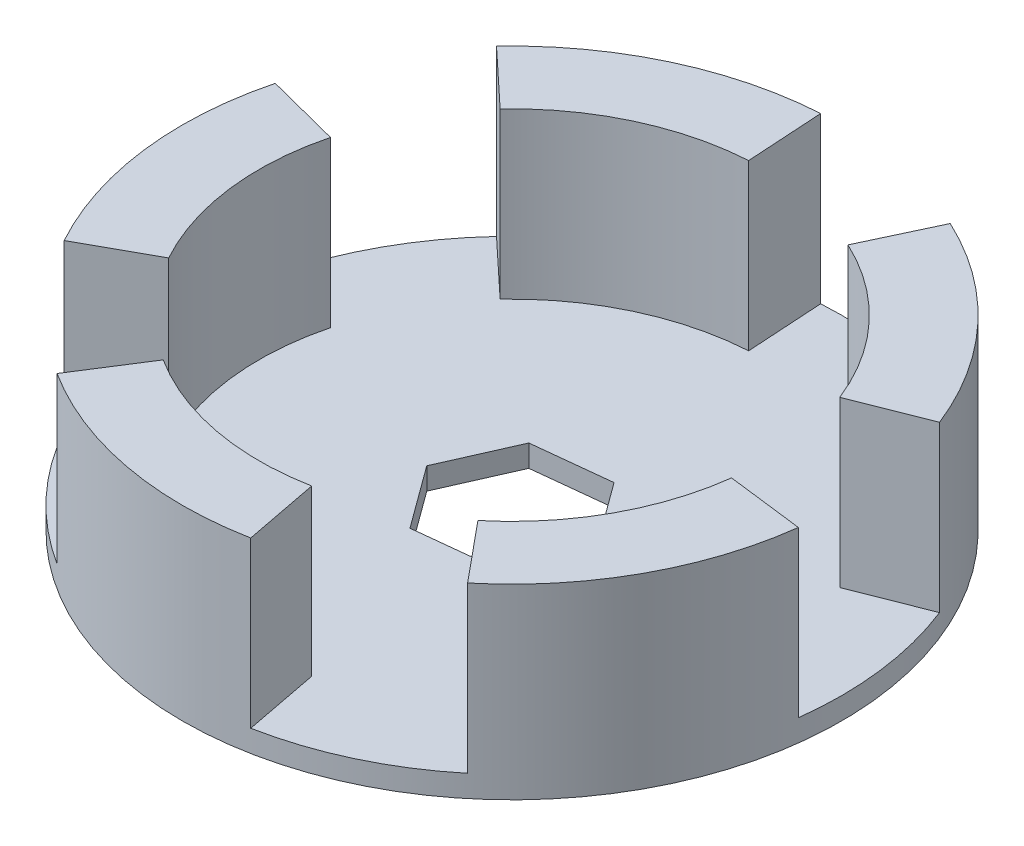
ISO-10303-21;
HEADER;
FILE_DESCRIPTION(('STEP AP214'),'2;1');
FILE_NAME('part.step','',(''),(''),'','','');
FILE_SCHEMA(('AUTOMOTIVE_DESIGN { 1 0 10303 214 1 1 1 1 }'));
ENDSEC;
DATA;
#1=APPLICATION_CONTEXT('core data for automotive mechanical design processes');
#2=APPLICATION_PROTOCOL_DEFINITION('international standard','automotive_design',2000,#1);
#3=PRODUCT_CONTEXT('',#1,'mechanical');
#4=PRODUCT('Part','Part','',(#3));
#5=PRODUCT_RELATED_PRODUCT_CATEGORY('part','',(#4));
#6=PRODUCT_DEFINITION_FORMATION('','',#4);
#7=PRODUCT_DEFINITION_CONTEXT('part definition',#1,'design');
#8=PRODUCT_DEFINITION('design','',#6,#7);
#9=PRODUCT_DEFINITION_SHAPE('','',#8);
#10=(LENGTH_UNIT() NAMED_UNIT(*) SI_UNIT(.MILLI.,.METRE.));
#11=(NAMED_UNIT(*) PLANE_ANGLE_UNIT() SI_UNIT($,.RADIAN.));
#12=(NAMED_UNIT(*) SI_UNIT($,.STERADIAN.) SOLID_ANGLE_UNIT());
#13=UNCERTAINTY_MEASURE_WITH_UNIT(LENGTH_MEASURE(1.E-05),#10,'distance_accuracy_value','');
#14=(GEOMETRIC_REPRESENTATION_CONTEXT(3) GLOBAL_UNCERTAINTY_ASSIGNED_CONTEXT((#13)) GLOBAL_UNIT_ASSIGNED_CONTEXT((#10,
#11,#12)) REPRESENTATION_CONTEXT('',''));
#15=CARTESIAN_POINT('',(0.,0.,0.));
#16=DIRECTION('',(0.,0.,1.));
#17=DIRECTION('',(1.,0.,0.));
#18=AXIS2_PLACEMENT_3D('',#15,#16,#17);
#19=CARTESIAN_POINT('',(0.,2.,0.));
#20=DIRECTION('',(0.,1.,0.));
#21=DIRECTION('',(0.,0.,1.));
#22=AXIS2_PLACEMENT_3D('',#19,#20,#21);
#23=PLANE('',#22);
#24=DIRECTION('',(-0.590285720446563,0.,-0.807194380701998));
#25=VECTOR('',#24,1.);
#26=CARTESIAN_POINT('',(4.92388572228219,2.,-3.60074289472403));
#27=LINE('',#26,#25);
#28=CARTESIAN_POINT('',(7.00277560183374,2.,-0.757936147505458));
#29=VERTEX_POINT('',#28);
#30=CARTESIAN_POINT('',(2.84499584273063,2.,-6.44354964194261));
#31=VERTEX_POINT('',#30);
#32=EDGE_CURVE('E257',#29,#31,#27,.T.);
#33=ORIENTED_EDGE('',*,*,#32,.F.);
#34=DIRECTION('',(0.403907979256696,0.,-0.914799619748922));
#35=VECTOR('',#34,1.);
#36=CARTESIAN_POINT('',(5.58027768046842,2.,2.46383867346585));
#37=LINE('',#36,#35);
#38=CARTESIAN_POINT('',(4.15777975910311,2.,5.68561349443715));
#39=VERTEX_POINT('',#38);
#40=EDGE_CURVE('E242',#39,#29,#37,.T.);
#41=ORIENTED_EDGE('',*,*,#40,.F.);
#42=DIRECTION('',(0.994193699703259,0.,-0.107605239046924));
#43=VECTOR('',#42,1.);
#44=CARTESIAN_POINT('',(0.656391958186239,2.,6.06458156818988));
#45=LINE('',#44,#43);
#46=CARTESIAN_POINT('',(-2.84499584273063,2.,6.44354964194261));
#47=VERTEX_POINT('',#46);
#48=EDGE_CURVE('E215',#47,#39,#45,.T.);
#49=ORIENTED_EDGE('',*,*,#48,.F.);
#50=DIRECTION('',(0.590285720446563,0.,0.807194380701998));
#51=VECTOR('',#50,1.);
#52=CARTESIAN_POINT('',(-4.92388572228219,2.,3.60074289472403));
#53=LINE('',#52,#51);
#54=CARTESIAN_POINT('',(-7.00277560183374,2.,0.75793614750546));
#55=VERTEX_POINT('',#54);
#56=EDGE_CURVE('E251',#55,#47,#53,.T.);
#57=ORIENTED_EDGE('',*,*,#56,.F.);
#58=DIRECTION('',(-0.403907979256696,0.,0.914799619748922));
#59=VECTOR('',#58,1.);
#60=CARTESIAN_POINT('',(-5.58027768046843,2.,-2.46383867346585));
#61=LINE('',#60,#59);
#62=CARTESIAN_POINT('',(-4.15777975910311,2.,-5.68561349443715));
#63=VERTEX_POINT('',#62);
#64=EDGE_CURVE('E253',#63,#55,#61,.T.);
#65=ORIENTED_EDGE('',*,*,#64,.F.);
#66=DIRECTION('',(-0.994193699703259,0.,0.107605239046924));
#67=VECTOR('',#66,1.);
#68=CARTESIAN_POINT('',(-0.656391958186239,2.,-6.06458156818988));
#69=LINE('',#68,#67);
#70=EDGE_CURVE('E255',#31,#63,#69,.T.);
#71=ORIENTED_EDGE('',*,*,#70,.F.);
#72=EDGE_LOOP('',(#33,#41,#49,#57,#65,#71));
#73=FACE_BOUND('',#72,.T.);
#74=CARTESIAN_POINT('',(0.,2.,0.));
#75=DIRECTION('',(0.,1.,0.));
#76=DIRECTION('',(0.,0.,1.));
#77=AXIS2_PLACEMENT_3D('',#74,#75,#76);
#78=CIRCLE('',#77,30.);
#79=CARTESIAN_POINT('',(-21.9070270257039,2.,-20.4959061008553));
#80=VERTEX_POINT('',#79);
#81=CARTESIAN_POINT('',(-29.0481518665361,2.,-7.4969909389473));
#82=VERTEX_POINT('',#81);
#83=EDGE_CURVE('E11',#80,#82,#78,.T.);
#84=ORIENTED_EDGE('',*,*,#83,.T.);
#85=DIRECTION('',(-0.968271728884535,0.,-0.249899697964911));
#86=VECTOR('',#85,1.);
#87=CARTESIAN_POINT('',(-22.2702497643443,2.,-5.74769305319293));
#88=LINE('',#87,#86);
#89=CARTESIAN_POINT('',(-22.2702497643443,2.,-5.74769305319293));
#90=VERTEX_POINT('',#89);
#91=EDGE_CURVE('E273',#90,#82,#88,.T.);
#92=ORIENTED_EDGE('',*,*,#91,.F.);
#93=CARTESIAN_POINT('',(0.,2.,0.));
#94=DIRECTION('',(0.,-1.,0.));
#95=DIRECTION('',(0.,0.,-1.));
#96=AXIS2_PLACEMENT_3D('',#93,#94,#95);
#97=CIRCLE('',#96,23.);
#98=CARTESIAN_POINT('',(-20.1345133380205,2.,11.1176154206321));
#99=VERTEX_POINT('',#98);
#100=EDGE_CURVE('E259',#99,#90,#97,.T.);
#101=ORIENTED_EDGE('',*,*,#100,.F.);
#102=DIRECTION('',(0.875413623392195,0.,-0.483374583505741));
#103=VECTOR('',#102,1.);
#104=CARTESIAN_POINT('',(-20.1345133380205,2.,11.1176154206321));
#105=LINE('',#104,#103);
#106=CARTESIAN_POINT('',(-26.2624087017658,2.,14.5012375051723));
#107=VERTEX_POINT('',#106);
#108=EDGE_CURVE('E264',#107,#99,#105,.T.);
#109=ORIENTED_EDGE('',*,*,#108,.F.);
#110=CARTESIAN_POINT('',(-16.1064346670355,2.,25.3097365121906));
#111=VERTEX_POINT('',#110);
#112=EDGE_CURVE('E44',#107,#111,#78,.T.);
#113=ORIENTED_EDGE('',*,*,#112,.T.);
#114=DIRECTION('',(-0.536881155567852,0.,0.843657883739688));
#115=VECTOR('',#114,1.);
#116=CARTESIAN_POINT('',(-12.3482665780606,2.,19.4041313260128));
#117=LINE('',#116,#115);
#118=CARTESIAN_POINT('',(-12.3482665780606,2.,19.4041313260128));
#119=VERTEX_POINT('',#118);
#120=EDGE_CURVE('E303',#119,#111,#117,.T.);
#121=ORIENTED_EDGE('',*,*,#120,.F.);
#122=CARTESIAN_POINT('',(0.,2.,0.));
#123=DIRECTION('',(0.,-1.,0.));
#124=DIRECTION('',(0.,0.,1.));
#125=AXIS2_PLACEMENT_3D('',#122,#123,#124);
#126=CIRCLE('',#125,23.);
#127=CARTESIAN_POINT('',(4.35157379653824,2.,22.5845922144563));
#128=VERTEX_POINT('',#127);
#129=EDGE_CURVE('E289',#128,#119,#126,.T.);
#130=ORIENTED_EDGE('',*,*,#129,.F.);
#131=DIRECTION('',(-0.189198860719054,0.,-0.981938791932884));
#132=VECTOR('',#131,1.);
#133=CARTESIAN_POINT('',(4.35157379653824,2.,22.5845922144563));
#134=LINE('',#133,#132);
#135=CARTESIAN_POINT('',(5.67596582157161,2.,29.4581637579865));
#136=VERTEX_POINT('',#135);
#137=EDGE_CURVE('E294',#136,#128,#134,.T.);
#138=ORIENTED_EDGE('',*,*,#137,.F.);
#139=CARTESIAN_POINT('',(19.0938278047285,2.,23.1392683497853));
#140=VERTEX_POINT('',#139);
#141=EDGE_CURVE('E414',#136,#140,#78,.T.);
#142=ORIENTED_EDGE('',*,*,#141,.T.);
#143=DIRECTION('',(0.636460926824284,0.,0.771308944992844));
#144=VECTOR('',#143,1.);
#145=CARTESIAN_POINT('',(14.6386013169585,2.,17.7401057348354));
#146=LINE('',#145,#144);
#147=CARTESIAN_POINT('',(14.6386013169585,2.,17.7401057348354));
#148=VERTEX_POINT('',#147);
#149=EDGE_CURVE('E333',#148,#140,#146,.T.);
#150=ORIENTED_EDGE('',*,*,#149,.F.);
#151=CARTESIAN_POINT('',(0.,2.,0.));
#152=DIRECTION('',(0.,-1.,0.));
#153=DIRECTION('',(0.,0.,-1.));
#154=AXIS2_PLACEMENT_3D('',#151,#152,#153);
#155=CIRCLE('',#154,23.);
#156=CARTESIAN_POINT('',(22.8239338488345,2.,2.8404301899582));
#157=VERTEX_POINT('',#156);
#158=EDGE_CURVE('E319',#157,#148,#155,.T.);
#159=ORIENTED_EDGE('',*,*,#158,.F.);
#160=DIRECTION('',(-0.992344949949327,0.,-0.123496964780791));
#161=VECTOR('',#160,1.);
#162=CARTESIAN_POINT('',(22.8239338488345,2.,2.8404301899582));
#163=LINE('',#162,#161);
#164=CARTESIAN_POINT('',(29.7703484984798,2.,3.70490894342374));
#165=VERTEX_POINT('',#164);
#166=EDGE_CURVE('E324',#165,#157,#163,.T.);
#167=ORIENTED_EDGE('',*,*,#166,.F.);
#168=CARTESIAN_POINT('',(27.9070692256955,2.,-11.0088821972186));
#169=VERTEX_POINT('',#168);
#170=EDGE_CURVE('E410',#165,#169,#78,.T.);
#171=ORIENTED_EDGE('',*,*,#170,.T.);
#172=DIRECTION('',(0.930235640856518,0.,-0.366962739907287));
#173=VECTOR('',#172,1.);
#174=CARTESIAN_POINT('',(21.3954197396999,2.,-8.4401430178676));
#175=LINE('',#174,#173);
#176=CARTESIAN_POINT('',(21.3954197396999,2.,-8.4401430178676));
#177=VERTEX_POINT('',#176);
#178=EDGE_CURVE('E363',#177,#169,#175,.T.);
#179=ORIENTED_EDGE('',*,*,#178,.F.);
#180=CARTESIAN_POINT('',(0.,2.,0.));
#181=DIRECTION('',(0.,-1.,0.));
#182=DIRECTION('',(0.,0.,-1.));
#183=AXIS2_PLACEMENT_3D('',#180,#181,#182);
#184=CIRCLE('',#183,23.);
#185=CARTESIAN_POINT('',(9.75439307902069,2.,-20.8291098143908));
#186=VERTEX_POINT('',#185);
#187=EDGE_CURVE('E349',#186,#177,#184,.T.);
#188=ORIENTED_EDGE('',*,*,#187,.F.);
#189=DIRECTION('',(-0.424104046913943,0.,0.905613470190906));
#190=VECTOR('',#189,1.);
#191=CARTESIAN_POINT('',(9.75439307902069,2.,-20.8291098143908));
#192=LINE('',#191,#190);
#193=CARTESIAN_POINT('',(12.7231214074183,2.,-27.1684041057272));
#194=VERTEX_POINT('',#193);
#195=EDGE_CURVE('E354',#194,#186,#192,.T.);
#196=ORIENTED_EDGE('',*,*,#195,.F.);
#197=CARTESIAN_POINT('',(-1.84631049685243,2.,-29.9431317258101));
#198=VERTEX_POINT('',#197);
#199=EDGE_CURVE('E45',#194,#198,#78,.T.);
#200=ORIENTED_EDGE('',*,*,#199,.T.);
#201=DIRECTION('',(-0.0615436832284145,0.,-0.998104390860335));
#202=VECTOR('',#201,1.);
#203=CARTESIAN_POINT('',(-1.41550471425354,2.,-22.9564009897877));
#204=LINE('',#203,#202);
#205=CARTESIAN_POINT('',(-1.41550471425354,2.,-22.9564009897877));
#206=VERTEX_POINT('',#205);
#207=EDGE_CURVE('E390',#206,#198,#204,.T.);
#208=ORIENTED_EDGE('',*,*,#207,.F.);
#209=CARTESIAN_POINT('',(0.,2.,0.));
#210=DIRECTION('',(0.,-1.,0.));
#211=DIRECTION('',(0.,0.,-1.));
#212=AXIS2_PLACEMENT_3D('',#209,#210,#211);
#213=CIRCLE('',#212,23.);
#214=CARTESIAN_POINT('',(-16.795387386373,2.,-15.7135280106558));
#215=VERTEX_POINT('',#214);
#216=EDGE_CURVE('E376',#215,#206,#213,.T.);
#217=ORIENTED_EDGE('',*,*,#216,.F.);
#218=DIRECTION('',(0.730234234190131,0.,0.68319687002851));
#219=VECTOR('',#218,1.);
#220=CARTESIAN_POINT('',(-16.795387386373,2.,-15.7135280106558));
#221=LINE('',#220,#219);
#222=EDGE_CURVE('E381',#80,#215,#221,.T.);
#223=ORIENTED_EDGE('',*,*,#222,.F.);
#224=EDGE_LOOP('',(#84,#92,#101,#109,#113,#121,#130,#138,#142,#150,#159,#167,#171,#179,#188,
#196,#200,#208,#217,#223));
#225=FACE_BOUND('',#224,.T.);
#226=ADVANCED_FACE('F35',(#73,#225),#23,.T.);
#227=CARTESIAN_POINT('',(0.,2.,0.));
#228=DIRECTION('',(0.,-1.,0.));
#229=DIRECTION('',(0.,0.,-1.));
#230=AXIS2_PLACEMENT_3D('',#227,#228,#229);
#231=CYLINDRICAL_SURFACE('',#230,30.);
#232=ORIENTED_EDGE('',*,*,#83,.F.);
#233=DIRECTION('',(0.,-1.,0.));
#234=VECTOR('',#233,1.);
#235=CARTESIAN_POINT('',(-21.9070270257039,17.,-20.4959061008553));
#236=LINE('',#235,#234);
#237=CARTESIAN_POINT('',(-21.9070270257039,17.,-20.4959061008553));
#238=VERTEX_POINT('',#237);
#239=EDGE_CURVE('E397',#238,#80,#236,.T.);
#240=ORIENTED_EDGE('',*,*,#239,.F.);
#241=CARTESIAN_POINT('',(0.,17.,0.));
#242=DIRECTION('',(0.,1.,0.));
#243=DIRECTION('',(0.,0.,1.));
#244=AXIS2_PLACEMENT_3D('',#241,#242,#243);
#245=CIRCLE('',#244,30.);
#246=CARTESIAN_POINT('',(-1.84631049685243,17.,-29.9431317258101));
#247=VERTEX_POINT('',#246);
#248=EDGE_CURVE('E383',#247,#238,#245,.T.);
#249=ORIENTED_EDGE('',*,*,#248,.F.);
#250=DIRECTION('',(0.,-1.,0.));
#251=VECTOR('',#250,1.);
#252=CARTESIAN_POINT('',(-1.84631049685243,17.,-29.9431317258101));
#253=LINE('',#252,#251);
#254=EDGE_CURVE('E400',#247,#198,#253,.T.);
#255=ORIENTED_EDGE('',*,*,#254,.T.);
#256=ORIENTED_EDGE('',*,*,#199,.F.);
#257=DIRECTION('',(0.,-1.,0.));
#258=VECTOR('',#257,1.);
#259=CARTESIAN_POINT('',(12.7231214074183,17.,-27.1684041057272));
#260=LINE('',#259,#258);
#261=CARTESIAN_POINT('',(12.7231214074183,17.,-27.1684041057272));
#262=VERTEX_POINT('',#261);
#263=EDGE_CURVE('E369',#262,#194,#260,.T.);
#264=ORIENTED_EDGE('',*,*,#263,.F.);
#265=CARTESIAN_POINT('',(0.,17.,0.));
#266=DIRECTION('',(0.,1.,0.));
#267=DIRECTION('',(0.,0.,-1.));
#268=AXIS2_PLACEMENT_3D('',#265,#266,#267);
#269=CIRCLE('',#268,30.);
#270=CARTESIAN_POINT('',(27.9070692256955,17.,-11.0088821972186));
#271=VERTEX_POINT('',#270);
#272=EDGE_CURVE('E356',#271,#262,#269,.T.);
#273=ORIENTED_EDGE('',*,*,#272,.F.);
#274=DIRECTION('',(0.,-1.,0.));
#275=VECTOR('',#274,1.);
#276=CARTESIAN_POINT('',(27.9070692256955,17.,-11.0088821972186));
#277=LINE('',#276,#275);
#278=EDGE_CURVE('E371',#271,#169,#277,.T.);
#279=ORIENTED_EDGE('',*,*,#278,.T.);
#280=ORIENTED_EDGE('',*,*,#170,.F.);
#281=DIRECTION('',(0.,-1.,0.));
#282=VECTOR('',#281,1.);
#283=CARTESIAN_POINT('',(29.7703484984798,17.,3.70490894342374));
#284=LINE('',#283,#282);
#285=CARTESIAN_POINT('',(29.7703484984798,17.,3.70490894342374));
#286=VERTEX_POINT('',#285);
#287=EDGE_CURVE('E340',#286,#165,#284,.T.);
#288=ORIENTED_EDGE('',*,*,#287,.F.);
#289=CARTESIAN_POINT('',(0.,17.,0.));
#290=DIRECTION('',(0.,1.,0.));
#291=DIRECTION('',(0.,0.,-1.));
#292=AXIS2_PLACEMENT_3D('',#289,#290,#291);
#293=CIRCLE('',#292,30.);
#294=CARTESIAN_POINT('',(19.0938278047285,17.,23.1392683497853));
#295=VERTEX_POINT('',#294);
#296=EDGE_CURVE('E326',#295,#286,#293,.T.);
#297=ORIENTED_EDGE('',*,*,#296,.F.);
#298=DIRECTION('',(0.,-1.,0.));
#299=VECTOR('',#298,1.);
#300=CARTESIAN_POINT('',(19.0938278047285,17.,23.1392683497853));
#301=LINE('',#300,#299);
#302=EDGE_CURVE('E343',#295,#140,#301,.T.);
#303=ORIENTED_EDGE('',*,*,#302,.T.);
#304=ORIENTED_EDGE('',*,*,#141,.F.);
#305=DIRECTION('',(0.,-1.,0.));
#306=VECTOR('',#305,1.);
#307=CARTESIAN_POINT('',(5.67596582157161,17.,29.4581637579865));
#308=LINE('',#307,#306);
#309=CARTESIAN_POINT('',(5.67596582157161,17.,29.4581637579865));
#310=VERTEX_POINT('',#309);
#311=EDGE_CURVE('E310',#310,#136,#308,.T.);
#312=ORIENTED_EDGE('',*,*,#311,.F.);
#313=CARTESIAN_POINT('',(0.,17.,0.));
#314=DIRECTION('',(0.,1.,0.));
#315=DIRECTION('',(0.,0.,-1.));
#316=AXIS2_PLACEMENT_3D('',#313,#314,#315);
#317=CIRCLE('',#316,30.);
#318=CARTESIAN_POINT('',(-16.1064346670355,17.,25.3097365121906));
#319=VERTEX_POINT('',#318);
#320=EDGE_CURVE('E296',#319,#310,#317,.T.);
#321=ORIENTED_EDGE('',*,*,#320,.F.);
#322=DIRECTION('',(0.,-1.,0.));
#323=VECTOR('',#322,1.);
#324=CARTESIAN_POINT('',(-16.1064346670355,17.,25.3097365121906));
#325=LINE('',#324,#323);
#326=EDGE_CURVE('E313',#319,#111,#325,.T.);
#327=ORIENTED_EDGE('',*,*,#326,.T.);
#328=ORIENTED_EDGE('',*,*,#112,.F.);
#329=DIRECTION('',(0.,-1.,0.));
#330=VECTOR('',#329,1.);
#331=CARTESIAN_POINT('',(-26.2624087017658,17.,14.5012375051723));
#332=LINE('',#331,#330);
#333=CARTESIAN_POINT('',(-26.2624087017658,17.,14.5012375051723));
#334=VERTEX_POINT('',#333);
#335=EDGE_CURVE('E280',#334,#107,#332,.T.);
#336=ORIENTED_EDGE('',*,*,#335,.F.);
#337=CARTESIAN_POINT('',(0.,17.,0.));
#338=DIRECTION('',(0.,1.,0.));
#339=DIRECTION('',(0.,0.,1.));
#340=AXIS2_PLACEMENT_3D('',#337,#338,#339);
#341=CIRCLE('',#340,30.);
#342=CARTESIAN_POINT('',(-29.048151866536,17.,-7.4969909389473));
#343=VERTEX_POINT('',#342);
#344=EDGE_CURVE('E266',#343,#334,#341,.T.);
#345=ORIENTED_EDGE('',*,*,#344,.F.);
#346=DIRECTION('',(0.,-1.,0.));
#347=VECTOR('',#346,1.);
#348=CARTESIAN_POINT('',(-29.048151866536,17.,-7.4969909389473));
#349=LINE('',#348,#347);
#350=EDGE_CURVE('E283',#343,#82,#349,.T.);
#351=ORIENTED_EDGE('',*,*,#350,.T.);
#352=EDGE_LOOP('',(#232,#240,#249,#255,#256,#264,#273,#279,#280,#288,#297,#303,#304,#312,#321,
#327,#328,#336,#345,#351));
#353=FACE_BOUND('',#352,.T.);
#354=CARTESIAN_POINT('',(0.,0.,0.));
#355=DIRECTION('',(0.,1.,0.));
#356=DIRECTION('',(0.,0.,1.));
#357=AXIS2_PLACEMENT_3D('',#354,#355,#356);
#358=CIRCLE('',#357,30.);
#359=CARTESIAN_POINT('',(0.,0.,30.));
#360=VERTEX_POINT('',#359);
#361=EDGE_CURVE('E39',#360,#360,#358,.T.);
#362=ORIENTED_EDGE('',*,*,#361,.T.);
#363=EDGE_LOOP('',(#362));
#364=FACE_BOUND('',#363,.T.);
#365=ADVANCED_FACE('F37',(#353,#364),#231,.T.);
#366=CARTESIAN_POINT('',(0.,0.,0.));
#367=DIRECTION('',(0.,1.,0.));
#368=DIRECTION('',(0.,0.,1.));
#369=AXIS2_PLACEMENT_3D('',#366,#367,#368);
#370=PLANE('',#369);
#371=DIRECTION('',(-0.403907979256696,0.,0.914799619748922));
#372=VECTOR('',#371,1.);
#373=CARTESIAN_POINT('',(7.00277560183374,0.,-0.757936147505458));
#374=LINE('',#373,#372);
#375=CARTESIAN_POINT('',(7.00277560183374,0.,-0.757936147505458));
#376=VERTEX_POINT('',#375);
#377=CARTESIAN_POINT('',(4.15777975910311,0.,5.68561349443715));
#378=VERTEX_POINT('',#377);
#379=EDGE_CURVE('E221',#376,#378,#374,.T.);
#380=ORIENTED_EDGE('',*,*,#379,.F.);
#381=DIRECTION('',(0.590285720446563,0.,0.807194380701998));
#382=VECTOR('',#381,1.);
#383=CARTESIAN_POINT('',(2.84499584273063,0.,-6.44354964194261));
#384=LINE('',#383,#382);
#385=CARTESIAN_POINT('',(2.84499584273063,0.,-6.44354964194261));
#386=VERTEX_POINT('',#385);
#387=EDGE_CURVE('E60',#386,#376,#384,.T.);
#388=ORIENTED_EDGE('',*,*,#387,.F.);
#389=DIRECTION('',(0.994193699703259,0.,-0.107605239046924));
#390=VECTOR('',#389,1.);
#391=CARTESIAN_POINT('',(-4.15777975910311,0.,-5.68561349443715));
#392=LINE('',#391,#390);
#393=CARTESIAN_POINT('',(-4.15777975910311,0.,-5.68561349443715));
#394=VERTEX_POINT('',#393);
#395=EDGE_CURVE('E237',#394,#386,#392,.T.);
#396=ORIENTED_EDGE('',*,*,#395,.F.);
#397=DIRECTION('',(0.403907979256696,0.,-0.914799619748922));
#398=VECTOR('',#397,1.);
#399=CARTESIAN_POINT('',(-7.00277560183374,0.,0.75793614750546));
#400=LINE('',#399,#398);
#401=CARTESIAN_POINT('',(-7.00277560183374,0.,0.75793614750546));
#402=VERTEX_POINT('',#401);
#403=EDGE_CURVE('E231',#402,#394,#400,.T.);
#404=ORIENTED_EDGE('',*,*,#403,.F.);
#405=DIRECTION('',(-0.590285720446563,0.,-0.807194380701998));
#406=VECTOR('',#405,1.);
#407=CARTESIAN_POINT('',(-2.84499584273063,0.,6.44354964194261));
#408=LINE('',#407,#406);
#409=CARTESIAN_POINT('',(-2.84499584273063,0.,6.44354964194261));
#410=VERTEX_POINT('',#409);
#411=EDGE_CURVE('E229',#410,#402,#408,.T.);
#412=ORIENTED_EDGE('',*,*,#411,.F.);
#413=DIRECTION('',(-0.994193699703259,0.,0.107605239046924));
#414=VECTOR('',#413,1.);
#415=CARTESIAN_POINT('',(4.15777975910311,0.,5.68561349443715));
#416=LINE('',#415,#414);
#417=EDGE_CURVE('E212',#378,#410,#416,.T.);
#418=ORIENTED_EDGE('',*,*,#417,.F.);
#419=EDGE_LOOP('',(#380,#388,#396,#404,#412,#418));
#420=FACE_BOUND('',#419,.T.);
#421=ORIENTED_EDGE('',*,*,#361,.F.);
#422=EDGE_LOOP('',(#421));
#423=FACE_BOUND('',#422,.T.);
#424=ADVANCED_FACE('F225',(#420,#423),#370,.F.);
#425=CARTESIAN_POINT('',(0.,17.,0.));
#426=DIRECTION('',(0.,-1.,0.));
#427=DIRECTION('',(0.,0.,-1.));
#428=AXIS2_PLACEMENT_3D('',#425,#426,#427);
#429=CYLINDRICAL_SURFACE('',#428,23.);
#430=ORIENTED_EDGE('',*,*,#216,.T.);
#431=DIRECTION('',(0.,-1.,0.));
#432=VECTOR('',#431,1.);
#433=CARTESIAN_POINT('',(-1.41550471425354,17.,-22.9564009897877));
#434=LINE('',#433,#432);
#435=CARTESIAN_POINT('',(-1.41550471425354,17.,-22.9564009897877));
#436=VERTEX_POINT('',#435);
#437=EDGE_CURVE('E403',#436,#206,#434,.T.);
#438=ORIENTED_EDGE('',*,*,#437,.F.);
#439=CARTESIAN_POINT('',(0.,17.,0.));
#440=DIRECTION('',(0.,-1.,0.));
#441=DIRECTION('',(0.,0.,-1.));
#442=AXIS2_PLACEMENT_3D('',#439,#440,#441);
#443=CIRCLE('',#442,23.);
#444=CARTESIAN_POINT('',(-16.795387386373,17.,-15.7135280106558));
#445=VERTEX_POINT('',#444);
#446=EDGE_CURVE('E377',#445,#436,#443,.T.);
#447=ORIENTED_EDGE('',*,*,#446,.F.);
#448=DIRECTION('',(0.,-1.,0.));
#449=VECTOR('',#448,1.);
#450=CARTESIAN_POINT('',(-16.795387386373,17.,-15.7135280106558));
#451=LINE('',#450,#449);
#452=EDGE_CURVE('E387',#445,#215,#451,.T.);
#453=ORIENTED_EDGE('',*,*,#452,.T.);
#454=EDGE_LOOP('',(#430,#438,#447,#453));
#455=FACE_BOUND('',#454,.T.);
#456=ADVANCED_FACE('F454',(#455),#429,.F.);
#457=CARTESIAN_POINT('',(-1.41550471425354,17.,-22.9564009897877));
#458=DIRECTION('',(-0.998104390860335,0.,0.0615436832284145));
#459=DIRECTION('',(0.0615436832284145,0.,0.998104390860335));
#460=AXIS2_PLACEMENT_3D('',#457,#458,#459);
#461=PLANE('',#460);
#462=ORIENTED_EDGE('',*,*,#207,.T.);
#463=ORIENTED_EDGE('',*,*,#254,.F.);
#464=DIRECTION('',(-0.0615436832284145,0.,-0.998104390860335));
#465=VECTOR('',#464,1.);
#466=CARTESIAN_POINT('',(-1.41550471425354,17.,-22.9564009897877));
#467=LINE('',#466,#465);
#468=EDGE_CURVE('E380',#436,#247,#467,.T.);
#469=ORIENTED_EDGE('',*,*,#468,.F.);
#470=ORIENTED_EDGE('',*,*,#437,.T.);
#471=EDGE_LOOP('',(#462,#463,#469,#470));
#472=FACE_BOUND('',#471,.T.);
#473=ADVANCED_FACE('F460',(#472),#461,.F.);
#474=CARTESIAN_POINT('',(-16.795387386373,17.,-15.7135280106558));
#475=DIRECTION('',(0.68319687002851,0.,-0.730234234190131));
#476=DIRECTION('',(-0.730234234190131,0.,-0.68319687002851));
#477=AXIS2_PLACEMENT_3D('',#474,#475,#476);
#478=PLANE('',#477);
#479=ORIENTED_EDGE('',*,*,#222,.T.);
#480=ORIENTED_EDGE('',*,*,#452,.F.);
#481=DIRECTION('',(0.730234234190131,0.,0.68319687002851));
#482=VECTOR('',#481,1.);
#483=CARTESIAN_POINT('',(-16.795387386373,17.,-15.7135280106558));
#484=LINE('',#483,#482);
#485=EDGE_CURVE('E385',#238,#445,#484,.T.);
#486=ORIENTED_EDGE('',*,*,#485,.F.);
#487=ORIENTED_EDGE('',*,*,#239,.T.);
#488=EDGE_LOOP('',(#479,#480,#486,#487));
#489=FACE_BOUND('',#488,.T.);
#490=ADVANCED_FACE('F465',(#489),#478,.F.);
#491=CARTESIAN_POINT('',(0.,17.,0.));
#492=DIRECTION('',(0.,-1.,0.));
#493=DIRECTION('',(0.,0.,-1.));
#494=AXIS2_PLACEMENT_3D('',#491,#492,#493);
#495=PLANE('',#494);
#496=ORIENTED_EDGE('',*,*,#446,.T.);
#497=ORIENTED_EDGE('',*,*,#468,.T.);
#498=ORIENTED_EDGE('',*,*,#248,.T.);
#499=ORIENTED_EDGE('',*,*,#485,.T.);
#500=EDGE_LOOP('',(#496,#497,#498,#499));
#501=FACE_BOUND('',#500,.T.);
#502=ADVANCED_FACE('F620',(#501),#495,.F.);
#503=CARTESIAN_POINT('',(0.,17.,0.));
#504=DIRECTION('',(0.,-1.,0.));
#505=DIRECTION('',(0.,0.,-1.));
#506=AXIS2_PLACEMENT_3D('',#503,#504,#505);
#507=CYLINDRICAL_SURFACE('',#506,23.);
#508=ORIENTED_EDGE('',*,*,#187,.T.);
#509=DIRECTION('',(0.,-1.,0.));
#510=VECTOR('',#509,1.);
#511=CARTESIAN_POINT('',(21.3954197396999,17.,-8.4401430178676));
#512=LINE('',#511,#510);
#513=CARTESIAN_POINT('',(21.3954197396999,17.,-8.4401430178676));
#514=VERTEX_POINT('',#513);
#515=EDGE_CURVE('E374',#514,#177,#512,.T.);
#516=ORIENTED_EDGE('',*,*,#515,.F.);
#517=CARTESIAN_POINT('',(0.,17.,0.));
#518=DIRECTION('',(0.,-1.,0.));
#519=DIRECTION('',(0.,0.,-1.));
#520=AXIS2_PLACEMENT_3D('',#517,#518,#519);
#521=CIRCLE('',#520,23.);
#522=CARTESIAN_POINT('',(9.75439307902069,17.,-20.8291098143908));
#523=VERTEX_POINT('',#522);
#524=EDGE_CURVE('E350',#523,#514,#521,.T.);
#525=ORIENTED_EDGE('',*,*,#524,.F.);
#526=DIRECTION('',(0.,-1.,0.));
#527=VECTOR('',#526,1.);
#528=CARTESIAN_POINT('',(9.75439307902069,17.,-20.8291098143908));
#529=LINE('',#528,#527);
#530=EDGE_CURVE('E360',#523,#186,#529,.T.);
#531=ORIENTED_EDGE('',*,*,#530,.T.);
#532=EDGE_LOOP('',(#508,#516,#525,#531));
#533=FACE_BOUND('',#532,.T.);
#534=ADVANCED_FACE('F628',(#533),#507,.F.);
#535=CARTESIAN_POINT('',(21.3954197396999,17.,-8.4401430178676));
#536=DIRECTION('',(-0.366962739907287,0.,-0.930235640856518));
#537=DIRECTION('',(-0.930235640856518,0.,0.366962739907287));
#538=AXIS2_PLACEMENT_3D('',#535,#536,#537);
#539=PLANE('',#538);
#540=ORIENTED_EDGE('',*,*,#178,.T.);
#541=ORIENTED_EDGE('',*,*,#278,.F.);
#542=DIRECTION('',(0.930235640856518,0.,-0.366962739907287));
#543=VECTOR('',#542,1.);
#544=CARTESIAN_POINT('',(21.3954197396999,17.,-8.4401430178676));
#545=LINE('',#544,#543);
#546=EDGE_CURVE('E353',#514,#271,#545,.T.);
#547=ORIENTED_EDGE('',*,*,#546,.F.);
#548=ORIENTED_EDGE('',*,*,#515,.T.);
#549=EDGE_LOOP('',(#540,#541,#547,#548));
#550=FACE_BOUND('',#549,.T.);
#551=ADVANCED_FACE('F637',(#550),#539,.F.);
#552=CARTESIAN_POINT('',(9.75439307902069,17.,-20.8291098143908));
#553=DIRECTION('',(0.905613470190906,0.,0.424104046913943));
#554=DIRECTION('',(0.424104046913943,0.,-0.905613470190906));
#555=AXIS2_PLACEMENT_3D('',#552,#553,#554);
#556=PLANE('',#555);
#557=ORIENTED_EDGE('',*,*,#195,.T.);
#558=ORIENTED_EDGE('',*,*,#530,.F.);
#559=DIRECTION('',(-0.424104046913943,0.,0.905613470190906));
#560=VECTOR('',#559,1.);
#561=CARTESIAN_POINT('',(9.75439307902069,17.,-20.8291098143908));
#562=LINE('',#561,#560);
#563=EDGE_CURVE('E358',#262,#523,#562,.T.);
#564=ORIENTED_EDGE('',*,*,#563,.F.);
#565=ORIENTED_EDGE('',*,*,#263,.T.);
#566=EDGE_LOOP('',(#557,#558,#564,#565));
#567=FACE_BOUND('',#566,.T.);
#568=ADVANCED_FACE('F646',(#567),#556,.F.);
#569=CARTESIAN_POINT('',(0.,17.,0.));
#570=DIRECTION('',(0.,-1.,0.));
#571=DIRECTION('',(0.,0.,-1.));
#572=AXIS2_PLACEMENT_3D('',#569,#570,#571);
#573=PLANE('',#572);
#574=ORIENTED_EDGE('',*,*,#524,.T.);
#575=ORIENTED_EDGE('',*,*,#546,.T.);
#576=ORIENTED_EDGE('',*,*,#272,.T.);
#577=ORIENTED_EDGE('',*,*,#563,.T.);
#578=EDGE_LOOP('',(#574,#575,#576,#577));
#579=FACE_BOUND('',#578,.T.);
#580=ADVANCED_FACE('F655',(#579),#573,.F.);
#581=CARTESIAN_POINT('',(0.,17.,0.));
#582=DIRECTION('',(0.,-1.,0.));
#583=DIRECTION('',(0.,0.,-1.));
#584=AXIS2_PLACEMENT_3D('',#581,#582,#583);
#585=CYLINDRICAL_SURFACE('',#584,23.);
#586=ORIENTED_EDGE('',*,*,#158,.T.);
#587=DIRECTION('',(0.,-1.,0.));
#588=VECTOR('',#587,1.);
#589=CARTESIAN_POINT('',(14.6386013169585,17.,17.7401057348354));
#590=LINE('',#589,#588);
#591=CARTESIAN_POINT('',(14.6386013169585,17.,17.7401057348354));
#592=VERTEX_POINT('',#591);
#593=EDGE_CURVE('E346',#592,#148,#590,.T.);
#594=ORIENTED_EDGE('',*,*,#593,.F.);
#595=CARTESIAN_POINT('',(0.,17.,0.));
#596=DIRECTION('',(0.,-1.,0.));
#597=DIRECTION('',(0.,0.,-1.));
#598=AXIS2_PLACEMENT_3D('',#595,#596,#597);
#599=CIRCLE('',#598,23.);
#600=CARTESIAN_POINT('',(22.8239338488345,17.,2.8404301899582));
#601=VERTEX_POINT('',#600);
#602=EDGE_CURVE('E320',#601,#592,#599,.T.);
#603=ORIENTED_EDGE('',*,*,#602,.F.);
#604=DIRECTION('',(0.,-1.,0.));
#605=VECTOR('',#604,1.);
#606=CARTESIAN_POINT('',(22.8239338488345,17.,2.8404301899582));
#607=LINE('',#606,#605);
#608=EDGE_CURVE('E330',#601,#157,#607,.T.);
#609=ORIENTED_EDGE('',*,*,#608,.T.);
#610=EDGE_LOOP('',(#586,#594,#603,#609));
#611=FACE_BOUND('',#610,.T.);
#612=ADVANCED_FACE('F664',(#611),#585,.F.);
#613=CARTESIAN_POINT('',(14.6386013169585,17.,17.7401057348354));
#614=DIRECTION('',(0.771308944992844,0.,-0.636460926824284));
#615=DIRECTION('',(-0.636460926824284,0.,-0.771308944992844));
#616=AXIS2_PLACEMENT_3D('',#613,#614,#615);
#617=PLANE('',#616);
#618=ORIENTED_EDGE('',*,*,#149,.T.);
#619=ORIENTED_EDGE('',*,*,#302,.F.);
#620=DIRECTION('',(0.636460926824284,0.,0.771308944992844));
#621=VECTOR('',#620,1.);
#622=CARTESIAN_POINT('',(14.6386013169585,17.,17.7401057348354));
#623=LINE('',#622,#621);
#624=EDGE_CURVE('E323',#592,#295,#623,.T.);
#625=ORIENTED_EDGE('',*,*,#624,.F.);
#626=ORIENTED_EDGE('',*,*,#593,.T.);
#627=EDGE_LOOP('',(#618,#619,#625,#626));
#628=FACE_BOUND('',#627,.T.);
#629=ADVANCED_FACE('F673',(#628),#617,.F.);
#630=CARTESIAN_POINT('',(22.8239338488345,17.,2.8404301899582));
#631=DIRECTION('',(-0.123496964780791,0.,0.992344949949327));
#632=DIRECTION('',(0.992344949949327,0.,0.123496964780791));
#633=AXIS2_PLACEMENT_3D('',#630,#631,#632);
#634=PLANE('',#633);
#635=ORIENTED_EDGE('',*,*,#166,.T.);
#636=ORIENTED_EDGE('',*,*,#608,.F.);
#637=DIRECTION('',(-0.992344949949327,0.,-0.123496964780791));
#638=VECTOR('',#637,1.);
#639=CARTESIAN_POINT('',(22.8239338488345,17.,2.8404301899582));
#640=LINE('',#639,#638);
#641=EDGE_CURVE('E328',#286,#601,#640,.T.);
#642=ORIENTED_EDGE('',*,*,#641,.F.);
#643=ORIENTED_EDGE('',*,*,#287,.T.);
#644=EDGE_LOOP('',(#635,#636,#642,#643));
#645=FACE_BOUND('',#644,.T.);
#646=ADVANCED_FACE('F682',(#645),#634,.F.);
#647=CARTESIAN_POINT('',(0.,17.,0.));
#648=DIRECTION('',(0.,-1.,0.));
#649=DIRECTION('',(0.,0.,-1.));
#650=AXIS2_PLACEMENT_3D('',#647,#648,#649);
#651=PLANE('',#650);
#652=ORIENTED_EDGE('',*,*,#602,.T.);
#653=ORIENTED_EDGE('',*,*,#624,.T.);
#654=ORIENTED_EDGE('',*,*,#296,.T.);
#655=ORIENTED_EDGE('',*,*,#641,.T.);
#656=EDGE_LOOP('',(#652,#653,#654,#655));
#657=FACE_BOUND('',#656,.T.);
#658=ADVANCED_FACE('F691',(#657),#651,.F.);
#659=CARTESIAN_POINT('',(0.,17.,0.));
#660=DIRECTION('',(0.,-1.,0.));
#661=DIRECTION('',(0.,0.,-1.));
#662=AXIS2_PLACEMENT_3D('',#659,#660,#661);
#663=CYLINDRICAL_SURFACE('',#662,23.);
#664=ORIENTED_EDGE('',*,*,#129,.T.);
#665=DIRECTION('',(0.,-1.,0.));
#666=VECTOR('',#665,1.);
#667=CARTESIAN_POINT('',(-12.3482665780606,17.,19.4041313260128));
#668=LINE('',#667,#666);
#669=CARTESIAN_POINT('',(-12.3482665780606,17.,19.4041313260128));
#670=VERTEX_POINT('',#669);
#671=EDGE_CURVE('E316',#670,#119,#668,.T.);
#672=ORIENTED_EDGE('',*,*,#671,.F.);
#673=CARTESIAN_POINT('',(0.,17.,0.));
#674=DIRECTION('',(0.,-1.,0.));
#675=DIRECTION('',(0.,0.,1.));
#676=AXIS2_PLACEMENT_3D('',#673,#674,#675);
#677=CIRCLE('',#676,23.);
#678=CARTESIAN_POINT('',(4.35157379653824,17.,22.5845922144563));
#679=VERTEX_POINT('',#678);
#680=EDGE_CURVE('E290',#679,#670,#677,.T.);
#681=ORIENTED_EDGE('',*,*,#680,.F.);
#682=DIRECTION('',(0.,-1.,0.));
#683=VECTOR('',#682,1.);
#684=CARTESIAN_POINT('',(4.35157379653824,17.,22.5845922144563));
#685=LINE('',#684,#683);
#686=EDGE_CURVE('E300',#679,#128,#685,.T.);
#687=ORIENTED_EDGE('',*,*,#686,.T.);
#688=EDGE_LOOP('',(#664,#672,#681,#687));
#689=FACE_BOUND('',#688,.T.);
#690=ADVANCED_FACE('F434',(#689),#663,.F.);
#691=CARTESIAN_POINT('',(-12.3482665780606,17.,19.4041313260128));
#692=DIRECTION('',(0.843657883739688,0.,0.536881155567851));
#693=DIRECTION('',(0.536881155567852,0.,-0.843657883739688));
#694=AXIS2_PLACEMENT_3D('',#691,#692,#693);
#695=PLANE('',#694);
#696=ORIENTED_EDGE('',*,*,#120,.T.);
#697=ORIENTED_EDGE('',*,*,#326,.F.);
#698=DIRECTION('',(-0.536881155567852,0.,0.843657883739688));
#699=VECTOR('',#698,1.);
#700=CARTESIAN_POINT('',(-12.3482665780606,17.,19.4041313260128));
#701=LINE('',#700,#699);
#702=EDGE_CURVE('E293',#670,#319,#701,.T.);
#703=ORIENTED_EDGE('',*,*,#702,.F.);
#704=ORIENTED_EDGE('',*,*,#671,.T.);
#705=EDGE_LOOP('',(#696,#697,#703,#704));
#706=FACE_BOUND('',#705,.T.);
#707=ADVANCED_FACE('F423',(#706),#695,.F.);
#708=CARTESIAN_POINT('',(4.35157379653824,17.,22.5845922144563));
#709=DIRECTION('',(-0.981938791932884,0.,0.189198860719054));
#710=DIRECTION('',(0.189198860719054,0.,0.981938791932884));
#711=AXIS2_PLACEMENT_3D('',#708,#709,#710);
#712=PLANE('',#711);
#713=ORIENTED_EDGE('',*,*,#137,.T.);
#714=ORIENTED_EDGE('',*,*,#686,.F.);
#715=DIRECTION('',(-0.189198860719054,0.,-0.981938791932884));
#716=VECTOR('',#715,1.);
#717=CARTESIAN_POINT('',(4.35157379653824,17.,22.5845922144563));
#718=LINE('',#717,#716);
#719=EDGE_CURVE('E298',#310,#679,#718,.T.);
#720=ORIENTED_EDGE('',*,*,#719,.F.);
#721=ORIENTED_EDGE('',*,*,#311,.T.);
#722=EDGE_LOOP('',(#713,#714,#720,#721));
#723=FACE_BOUND('',#722,.T.);
#724=ADVANCED_FACE('F436',(#723),#712,.F.);
#725=CARTESIAN_POINT('',(0.,17.,0.));
#726=DIRECTION('',(0.,1.,0.));
#727=DIRECTION('',(0.,0.,1.));
#728=AXIS2_PLACEMENT_3D('',#725,#726,#727);
#729=PLANE('',#728);
#730=ORIENTED_EDGE('',*,*,#680,.T.);
#731=ORIENTED_EDGE('',*,*,#702,.T.);
#732=ORIENTED_EDGE('',*,*,#320,.T.);
#733=ORIENTED_EDGE('',*,*,#719,.T.);
#734=EDGE_LOOP('',(#730,#731,#732,#733));
#735=FACE_BOUND('',#734,.T.);
#736=ADVANCED_FACE('F430',(#735),#729,.T.);
#737=CARTESIAN_POINT('',(0.,17.,0.));
#738=DIRECTION('',(0.,-1.,0.));
#739=DIRECTION('',(0.,0.,-1.));
#740=AXIS2_PLACEMENT_3D('',#737,#738,#739);
#741=CYLINDRICAL_SURFACE('',#740,23.);
#742=ORIENTED_EDGE('',*,*,#100,.T.);
#743=DIRECTION('',(0.,-1.,0.));
#744=VECTOR('',#743,1.);
#745=CARTESIAN_POINT('',(-22.2702497643443,17.,-5.74769305319293));
#746=LINE('',#745,#744);
#747=CARTESIAN_POINT('',(-22.2702497643443,17.,-5.74769305319293));
#748=VERTEX_POINT('',#747);
#749=EDGE_CURVE('E286',#748,#90,#746,.T.);
#750=ORIENTED_EDGE('',*,*,#749,.F.);
#751=CARTESIAN_POINT('',(0.,17.,0.));
#752=DIRECTION('',(0.,-1.,0.));
#753=DIRECTION('',(0.,0.,-1.));
#754=AXIS2_PLACEMENT_3D('',#751,#752,#753);
#755=CIRCLE('',#754,23.);
#756=CARTESIAN_POINT('',(-20.1345133380205,17.,11.1176154206321));
#757=VERTEX_POINT('',#756);
#758=EDGE_CURVE('E260',#757,#748,#755,.T.);
#759=ORIENTED_EDGE('',*,*,#758,.F.);
#760=DIRECTION('',(0.,-1.,0.));
#761=VECTOR('',#760,1.);
#762=CARTESIAN_POINT('',(-20.1345133380205,17.,11.1176154206321));
#763=LINE('',#762,#761);
#764=EDGE_CURVE('E270',#757,#99,#763,.T.);
#765=ORIENTED_EDGE('',*,*,#764,.T.);
#766=EDGE_LOOP('',(#742,#750,#759,#765));
#767=FACE_BOUND('',#766,.T.);
#768=ADVANCED_FACE('F443',(#767),#741,.F.);
#769=CARTESIAN_POINT('',(-22.2702497643443,17.,-5.74769305319293));
#770=DIRECTION('',(-0.249899697964911,0.,0.968271728884535));
#771=DIRECTION('',(0.968271728884535,0.,0.249899697964911));
#772=AXIS2_PLACEMENT_3D('',#769,#770,#771);
#773=PLANE('',#772);
#774=ORIENTED_EDGE('',*,*,#91,.T.);
#775=ORIENTED_EDGE('',*,*,#350,.F.);
#776=DIRECTION('',(-0.968271728884535,0.,-0.249899697964911));
#777=VECTOR('',#776,1.);
#778=CARTESIAN_POINT('',(-22.2702497643443,17.,-5.74769305319293));
#779=LINE('',#778,#777);
#780=EDGE_CURVE('E263',#748,#343,#779,.T.);
#781=ORIENTED_EDGE('',*,*,#780,.F.);
#782=ORIENTED_EDGE('',*,*,#749,.T.);
#783=EDGE_LOOP('',(#774,#775,#781,#782));
#784=FACE_BOUND('',#783,.T.);
#785=ADVANCED_FACE('F475',(#784),#773,.F.);
#786=CARTESIAN_POINT('',(-20.1345133380205,17.,11.1176154206321));
#787=DIRECTION('',(-0.483374583505741,0.,-0.875413623392195));
#788=DIRECTION('',(-0.875413623392195,0.,0.483374583505741));
#789=AXIS2_PLACEMENT_3D('',#786,#787,#788);
#790=PLANE('',#789);
#791=ORIENTED_EDGE('',*,*,#108,.T.);
#792=ORIENTED_EDGE('',*,*,#764,.F.);
#793=DIRECTION('',(0.875413623392195,0.,-0.483374583505741));
#794=VECTOR('',#793,1.);
#795=CARTESIAN_POINT('',(-20.1345133380205,17.,11.1176154206321));
#796=LINE('',#795,#794);
#797=EDGE_CURVE('E268',#334,#757,#796,.T.);
#798=ORIENTED_EDGE('',*,*,#797,.F.);
#799=ORIENTED_EDGE('',*,*,#335,.T.);
#800=EDGE_LOOP('',(#791,#792,#798,#799));
#801=FACE_BOUND('',#800,.T.);
#802=ADVANCED_FACE('F481',(#801),#790,.F.);
#803=CARTESIAN_POINT('',(0.,17.,0.));
#804=DIRECTION('',(0.,-1.,0.));
#805=DIRECTION('',(0.,0.,-1.));
#806=AXIS2_PLACEMENT_3D('',#803,#804,#805);
#807=PLANE('',#806);
#808=ORIENTED_EDGE('',*,*,#758,.T.);
#809=ORIENTED_EDGE('',*,*,#780,.T.);
#810=ORIENTED_EDGE('',*,*,#344,.T.);
#811=ORIENTED_EDGE('',*,*,#797,.T.);
#812=EDGE_LOOP('',(#808,#809,#810,#811));
#813=FACE_BOUND('',#812,.T.);
#814=ADVANCED_FACE('F484',(#813),#807,.F.);
#815=CARTESIAN_POINT('',(2.84499584273063,10.,-6.44354964194261));
#816=DIRECTION('',(0.807194380701998,0.,-0.590285720446563));
#817=DIRECTION('',(-0.590285720446563,0.,-0.807194380701998));
#818=AXIS2_PLACEMENT_3D('',#815,#816,#817);
#819=PLANE('',#818);
#820=ORIENTED_EDGE('',*,*,#32,.T.);
#821=DIRECTION('',(0.,-1.,0.));
#822=VECTOR('',#821,1.);
#823=CARTESIAN_POINT('',(2.84499584273063,10.,-6.44354964194261));
#824=LINE('',#823,#822);
#825=EDGE_CURVE('E240',#31,#386,#824,.T.);
#826=ORIENTED_EDGE('',*,*,#825,.T.);
#827=ORIENTED_EDGE('',*,*,#387,.T.);
#828=DIRECTION('',(0.,-1.,0.));
#829=VECTOR('',#828,1.);
#830=CARTESIAN_POINT('',(7.00277560183374,10.,-0.757936147505458));
#831=LINE('',#830,#829);
#832=EDGE_CURVE('E218',#29,#376,#831,.T.);
#833=ORIENTED_EDGE('',*,*,#832,.F.);
#834=EDGE_LOOP('',(#820,#826,#827,#833));
#835=FACE_BOUND('',#834,.T.);
#836=ADVANCED_FACE('F486',(#835),#819,.F.);
#837=CARTESIAN_POINT('',(-4.15777975910311,10.,-5.68561349443715));
#838=DIRECTION('',(-0.107605239046924,0.,-0.994193699703259));
#839=DIRECTION('',(-0.994193699703259,0.,0.107605239046924));
#840=AXIS2_PLACEMENT_3D('',#837,#838,#839);
#841=PLANE('',#840);
#842=ORIENTED_EDGE('',*,*,#70,.T.);
#843=DIRECTION('',(0.,-1.,0.));
#844=VECTOR('',#843,1.);
#845=CARTESIAN_POINT('',(-4.15777975910311,10.,-5.68561349443715));
#846=LINE('',#845,#844);
#847=EDGE_CURVE('E243',#63,#394,#846,.T.);
#848=ORIENTED_EDGE('',*,*,#847,.T.);
#849=ORIENTED_EDGE('',*,*,#395,.T.);
#850=ORIENTED_EDGE('',*,*,#825,.F.);
#851=EDGE_LOOP('',(#842,#848,#849,#850));
#852=FACE_BOUND('',#851,.T.);
#853=ADVANCED_FACE('F492',(#852),#841,.F.);
#854=CARTESIAN_POINT('',(-7.00277560183374,10.,0.75793614750546));
#855=DIRECTION('',(-0.914799619748922,0.,-0.403907979256696));
#856=DIRECTION('',(-0.403907979256696,0.,0.914799619748922));
#857=AXIS2_PLACEMENT_3D('',#854,#855,#856);
#858=PLANE('',#857);
#859=ORIENTED_EDGE('',*,*,#64,.T.);
#860=DIRECTION('',(0.,-1.,0.));
#861=VECTOR('',#860,1.);
#862=CARTESIAN_POINT('',(-7.00277560183374,10.,0.75793614750546));
#863=LINE('',#862,#861);
#864=EDGE_CURVE('E245',#55,#402,#863,.T.);
#865=ORIENTED_EDGE('',*,*,#864,.T.);
#866=ORIENTED_EDGE('',*,*,#403,.T.);
#867=ORIENTED_EDGE('',*,*,#847,.F.);
#868=EDGE_LOOP('',(#859,#865,#866,#867));
#869=FACE_BOUND('',#868,.T.);
#870=ADVANCED_FACE('F541',(#869),#858,.F.);
#871=CARTESIAN_POINT('',(-2.84499584273063,10.,6.44354964194261));
#872=DIRECTION('',(-0.807194380701998,0.,0.590285720446563));
#873=DIRECTION('',(0.590285720446563,0.,0.807194380701998));
#874=AXIS2_PLACEMENT_3D('',#871,#872,#873);
#875=PLANE('',#874);
#876=ORIENTED_EDGE('',*,*,#56,.T.);
#877=DIRECTION('',(0.,-1.,0.));
#878=VECTOR('',#877,1.);
#879=CARTESIAN_POINT('',(-2.84499584273063,10.,6.44354964194261));
#880=LINE('',#879,#878);
#881=EDGE_CURVE('E217',#47,#410,#880,.T.);
#882=ORIENTED_EDGE('',*,*,#881,.T.);
#883=ORIENTED_EDGE('',*,*,#411,.T.);
#884=ORIENTED_EDGE('',*,*,#864,.F.);
#885=EDGE_LOOP('',(#876,#882,#883,#884));
#886=FACE_BOUND('',#885,.T.);
#887=ADVANCED_FACE('F551',(#886),#875,.F.);
#888=CARTESIAN_POINT('',(4.15777975910311,10.,5.68561349443715));
#889=DIRECTION('',(0.107605239046924,0.,0.994193699703259));
#890=DIRECTION('',(0.994193699703259,0.,-0.107605239046924));
#891=AXIS2_PLACEMENT_3D('',#888,#889,#890);
#892=PLANE('',#891);
#893=ORIENTED_EDGE('',*,*,#48,.T.);
#894=DIRECTION('',(0.,-1.,0.));
#895=VECTOR('',#894,1.);
#896=CARTESIAN_POINT('',(4.15777975910311,10.,5.68561349443715));
#897=LINE('',#896,#895);
#898=EDGE_CURVE('E52',#39,#378,#897,.T.);
#899=ORIENTED_EDGE('',*,*,#898,.T.);
#900=ORIENTED_EDGE('',*,*,#417,.T.);
#901=ORIENTED_EDGE('',*,*,#881,.F.);
#902=EDGE_LOOP('',(#893,#899,#900,#901));
#903=FACE_BOUND('',#902,.T.);
#904=ADVANCED_FACE('F209',(#903),#892,.F.);
#905=CARTESIAN_POINT('',(7.00277560183374,10.,-0.757936147505458));
#906=DIRECTION('',(0.914799619748922,0.,0.403907979256696));
#907=DIRECTION('',(0.403907979256696,0.,-0.914799619748922));
#908=AXIS2_PLACEMENT_3D('',#905,#906,#907);
#909=PLANE('',#908);
#910=ORIENTED_EDGE('',*,*,#40,.T.);
#911=ORIENTED_EDGE('',*,*,#832,.T.);
#912=ORIENTED_EDGE('',*,*,#379,.T.);
#913=ORIENTED_EDGE('',*,*,#898,.F.);
#914=EDGE_LOOP('',(#910,#911,#912,#913));
#915=FACE_BOUND('',#914,.T.);
#916=ADVANCED_FACE('F222',(#915),#909,.F.);
#917=CLOSED_SHELL('',(#226,#365,#424,#456,#473,#490,#502,#534,#551,#568,#580,#612,#629,#646,
#658,#690,#707,#724,#736,#768,#785,#802,#814,#836,#853,#870,#887,#904,#916));
#918=MANIFOLD_SOLID_BREP('B2',#917);
#919=ADVANCED_BREP_SHAPE_REPRESENTATION('',(#18,#918),#14);
#920=SHAPE_DEFINITION_REPRESENTATION(#9,#919);
ENDSEC;
END-ISO-10303-21;
